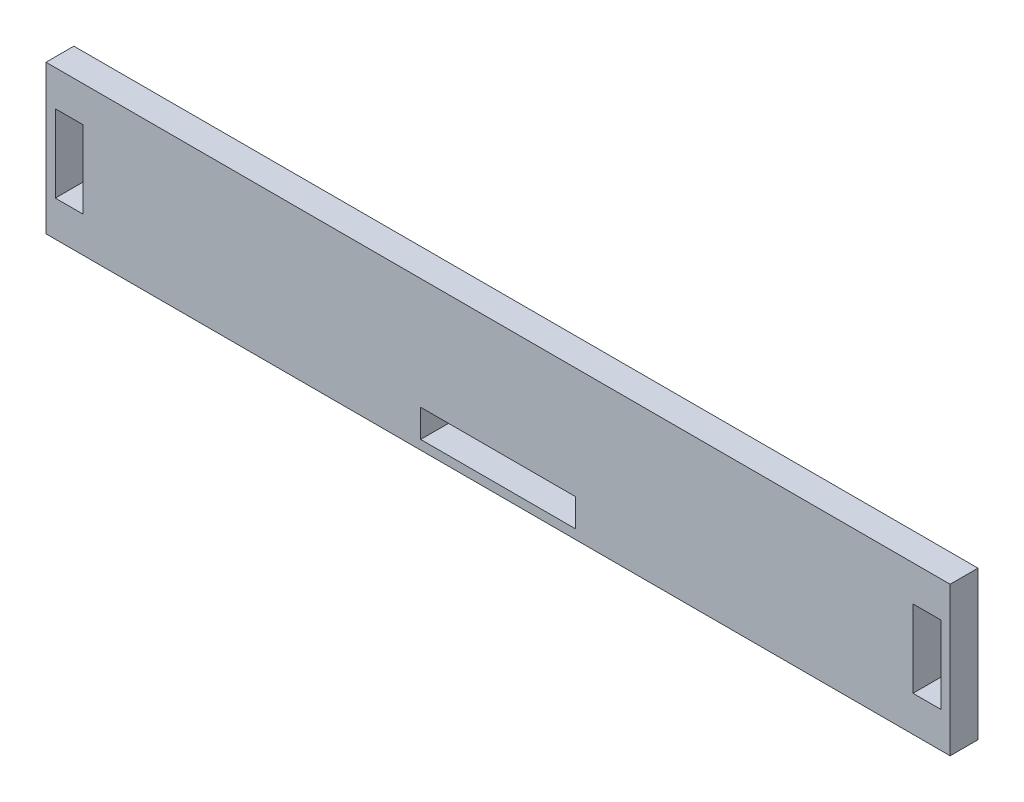
ISO-10303-21;
HEADER;
FILE_DESCRIPTION(('STEP AP214'),'2;1');
FILE_NAME('part.step','',(''),(''),'','','');
FILE_SCHEMA(('AUTOMOTIVE_DESIGN { 1 0 10303 214 1 1 1 1 }'));
ENDSEC;
DATA;
#1=APPLICATION_CONTEXT('core data for automotive mechanical design processes');
#2=APPLICATION_PROTOCOL_DEFINITION('international standard','automotive_design',2000,#1);
#3=PRODUCT_CONTEXT('',#1,'mechanical');
#4=PRODUCT('Part','Part','',(#3));
#5=PRODUCT_RELATED_PRODUCT_CATEGORY('part','',(#4));
#6=PRODUCT_DEFINITION_FORMATION('','',#4);
#7=PRODUCT_DEFINITION_CONTEXT('part definition',#1,'design');
#8=PRODUCT_DEFINITION('design','',#6,#7);
#9=PRODUCT_DEFINITION_SHAPE('','',#8);
#10=(LENGTH_UNIT() NAMED_UNIT(*) SI_UNIT(.MILLI.,.METRE.));
#11=(NAMED_UNIT(*) PLANE_ANGLE_UNIT() SI_UNIT($,.RADIAN.));
#12=(NAMED_UNIT(*) SI_UNIT($,.STERADIAN.) SOLID_ANGLE_UNIT());
#13=UNCERTAINTY_MEASURE_WITH_UNIT(LENGTH_MEASURE(1.E-05),#10,'distance_accuracy_value','');
#14=(GEOMETRIC_REPRESENTATION_CONTEXT(3) GLOBAL_UNCERTAINTY_ASSIGNED_CONTEXT((#13)) GLOBAL_UNIT_ASSIGNED_CONTEXT((#10,
#11,#12)) REPRESENTATION_CONTEXT('',''));
#15=CARTESIAN_POINT('',(0.,0.,0.));
#16=DIRECTION('',(0.,0.,1.));
#17=DIRECTION('',(1.,0.,0.));
#18=AXIS2_PLACEMENT_3D('',#15,#16,#17);
#19=CARTESIAN_POINT('',(0.,0.,18.));
#20=DIRECTION('',(0.,0.,-1.));
#21=DIRECTION('',(-1.,0.,0.));
#22=AXIS2_PLACEMENT_3D('',#19,#20,#21);
#23=PLANE('',#22);
#24=DIRECTION('',(0.,1.,0.));
#25=VECTOR('',#24,1.);
#26=CARTESIAN_POINT('',(24.,73.,18.));
#27=LINE('',#26,#25);
#28=CARTESIAN_POINT('',(24.,23.,18.));
#29=VERTEX_POINT('',#28);
#30=CARTESIAN_POINT('',(24.,73.,18.));
#31=VERTEX_POINT('',#30);
#32=EDGE_CURVE('E182',#29,#31,#27,.T.);
#33=ORIENTED_EDGE('',*,*,#32,.F.);
#34=DIRECTION('',(1.,0.,0.));
#35=VECTOR('',#34,1.);
#36=CARTESIAN_POINT('',(6.,23.,18.));
#37=LINE('',#36,#35);
#38=CARTESIAN_POINT('',(6.,23.,18.));
#39=VERTEX_POINT('',#38);
#40=EDGE_CURVE('E190',#39,#29,#37,.T.);
#41=ORIENTED_EDGE('',*,*,#40,.F.);
#42=DIRECTION('',(0.,-1.,0.));
#43=VECTOR('',#42,1.);
#44=CARTESIAN_POINT('',(6.,73.,18.));
#45=LINE('',#44,#43);
#46=CARTESIAN_POINT('',(6.,73.,18.));
#47=VERTEX_POINT('',#46);
#48=EDGE_CURVE('E187',#47,#39,#45,.T.);
#49=ORIENTED_EDGE('',*,*,#48,.F.);
#50=DIRECTION('',(-1.,0.,0.));
#51=VECTOR('',#50,1.);
#52=CARTESIAN_POINT('',(6.,73.,18.));
#53=LINE('',#52,#51);
#54=EDGE_CURVE('E184',#31,#47,#53,.T.);
#55=ORIENTED_EDGE('',*,*,#54,.F.);
#56=EDGE_LOOP('',(#33,#41,#49,#55));
#57=FACE_BOUND('',#56,.T.);
#58=DIRECTION('',(0.,-1.,0.));
#59=VECTOR('',#58,1.);
#60=CARTESIAN_POINT('',(0.,0.,18.));
#61=LINE('',#60,#59);
#62=CARTESIAN_POINT('',(0.,96.,18.));
#63=VERTEX_POINT('',#62);
#64=CARTESIAN_POINT('',(0.,0.,18.));
#65=VERTEX_POINT('',#64);
#66=EDGE_CURVE('E244',#63,#65,#61,.T.);
#67=ORIENTED_EDGE('',*,*,#66,.T.);
#68=DIRECTION('',(1.,0.,0.));
#69=VECTOR('',#68,1.);
#70=CARTESIAN_POINT('',(0.,0.,18.));
#71=LINE('',#70,#69);
#72=CARTESIAN_POINT('',(584.,0.,18.));
#73=VERTEX_POINT('',#72);
#74=EDGE_CURVE('E247',#65,#73,#71,.T.);
#75=ORIENTED_EDGE('',*,*,#74,.T.);
#76=DIRECTION('',(0.,1.,0.));
#77=VECTOR('',#76,1.);
#78=CARTESIAN_POINT('',(584.,0.,18.));
#79=LINE('',#78,#77);
#80=CARTESIAN_POINT('',(584.,96.,18.));
#81=VERTEX_POINT('',#80);
#82=EDGE_CURVE('E250',#73,#81,#79,.T.);
#83=ORIENTED_EDGE('',*,*,#82,.T.);
#84=DIRECTION('',(-1.,0.,0.));
#85=VECTOR('',#84,1.);
#86=CARTESIAN_POINT('',(0.,96.,18.));
#87=LINE('',#86,#85);
#88=EDGE_CURVE('E252',#81,#63,#87,.T.);
#89=ORIENTED_EDGE('',*,*,#88,.T.);
#90=EDGE_LOOP('',(#67,#75,#83,#89));
#91=FACE_BOUND('',#90,.T.);
#92=DIRECTION('',(0.,1.,0.));
#93=VECTOR('',#92,1.);
#94=CARTESIAN_POINT('',(342.,6.,18.));
#95=LINE('',#94,#93);
#96=CARTESIAN_POINT('',(342.,6.,18.));
#97=VERTEX_POINT('',#96);
#98=CARTESIAN_POINT('',(342.,24.,18.));
#99=VERTEX_POINT('',#98);
#100=EDGE_CURVE('E213',#97,#99,#95,.T.);
#101=ORIENTED_EDGE('',*,*,#100,.F.);
#102=DIRECTION('',(1.,0.,0.));
#103=VECTOR('',#102,1.);
#104=CARTESIAN_POINT('',(242.,6.,18.));
#105=LINE('',#104,#103);
#106=CARTESIAN_POINT('',(242.,6.,18.));
#107=VERTEX_POINT('',#106);
#108=EDGE_CURVE('E221',#107,#97,#105,.T.);
#109=ORIENTED_EDGE('',*,*,#108,.F.);
#110=DIRECTION('',(0.,-1.,0.));
#111=VECTOR('',#110,1.);
#112=CARTESIAN_POINT('',(242.,6.,18.));
#113=LINE('',#112,#111);
#114=CARTESIAN_POINT('',(242.,24.,18.));
#115=VERTEX_POINT('',#114);
#116=EDGE_CURVE('E218',#115,#107,#113,.T.);
#117=ORIENTED_EDGE('',*,*,#116,.F.);
#118=DIRECTION('',(-1.,0.,0.));
#119=VECTOR('',#118,1.);
#120=CARTESIAN_POINT('',(242.,24.,18.));
#121=LINE('',#120,#119);
#122=EDGE_CURVE('E215',#99,#115,#121,.T.);
#123=ORIENTED_EDGE('',*,*,#122,.F.);
#124=EDGE_LOOP('',(#101,#109,#117,#123));
#125=FACE_BOUND('',#124,.T.);
#126=DIRECTION('',(0.,1.,0.));
#127=VECTOR('',#126,1.);
#128=CARTESIAN_POINT('',(578.,73.,18.));
#129=LINE('',#128,#127);
#130=CARTESIAN_POINT('',(578.,23.0000000000001,18.));
#131=VERTEX_POINT('',#130);
#132=CARTESIAN_POINT('',(578.,73.,18.));
#133=VERTEX_POINT('',#132);
#134=EDGE_CURVE('E146',#131,#133,#129,.T.);
#135=ORIENTED_EDGE('',*,*,#134,.F.);
#136=DIRECTION('',(1.,0.,0.));
#137=VECTOR('',#136,1.);
#138=CARTESIAN_POINT('',(578.,23.0000000000001,18.));
#139=LINE('',#138,#137);
#140=CARTESIAN_POINT('',(560.,23.0000000000001,18.));
#141=VERTEX_POINT('',#140);
#142=EDGE_CURVE('E168',#141,#131,#139,.T.);
#143=ORIENTED_EDGE('',*,*,#142,.F.);
#144=DIRECTION('',(0.,-1.,0.));
#145=VECTOR('',#144,1.);
#146=CARTESIAN_POINT('',(560.,73.,18.));
#147=LINE('',#146,#145);
#148=CARTESIAN_POINT('',(560.,73.,18.));
#149=VERTEX_POINT('',#148);
#150=EDGE_CURVE('E166',#149,#141,#147,.T.);
#151=ORIENTED_EDGE('',*,*,#150,.F.);
#152=DIRECTION('',(-1.,0.,0.));
#153=VECTOR('',#152,1.);
#154=CARTESIAN_POINT('',(578.,73.,18.));
#155=LINE('',#154,#153);
#156=EDGE_CURVE('E154',#133,#149,#155,.T.);
#157=ORIENTED_EDGE('',*,*,#156,.F.);
#158=EDGE_LOOP('',(#135,#143,#151,#157));
#159=FACE_BOUND('',#158,.T.);
#160=ADVANCED_FACE('F33',(#57,#91,#125,#159),#23,.F.);
#161=CARTESIAN_POINT('',(0.,0.,0.));
#162=DIRECTION('',(0.,0.,-1.));
#163=DIRECTION('',(-1.,0.,0.));
#164=AXIS2_PLACEMENT_3D('',#161,#162,#163);
#165=PLANE('',#164);
#166=DIRECTION('',(0.,-1.,0.));
#167=VECTOR('',#166,1.);
#168=CARTESIAN_POINT('',(0.,0.,0.));
#169=LINE('',#168,#167);
#170=CARTESIAN_POINT('',(0.,96.,0.));
#171=VERTEX_POINT('',#170);
#172=CARTESIAN_POINT('',(0.,0.,0.));
#173=VERTEX_POINT('',#172);
#174=EDGE_CURVE('E243',#171,#173,#169,.T.);
#175=ORIENTED_EDGE('',*,*,#174,.F.);
#176=DIRECTION('',(-1.,0.,0.));
#177=VECTOR('',#176,1.);
#178=CARTESIAN_POINT('',(0.,96.,0.));
#179=LINE('',#178,#177);
#180=CARTESIAN_POINT('',(584.,96.,0.));
#181=VERTEX_POINT('',#180);
#182=EDGE_CURVE('E248',#181,#171,#179,.T.);
#183=ORIENTED_EDGE('',*,*,#182,.F.);
#184=DIRECTION('',(0.,1.,0.));
#185=VECTOR('',#184,1.);
#186=CARTESIAN_POINT('',(584.,0.,0.));
#187=LINE('',#186,#185);
#188=CARTESIAN_POINT('',(584.,0.,0.));
#189=VERTEX_POINT('',#188);
#190=EDGE_CURVE('E259',#189,#181,#187,.T.);
#191=ORIENTED_EDGE('',*,*,#190,.F.);
#192=DIRECTION('',(1.,0.,0.));
#193=VECTOR('',#192,1.);
#194=CARTESIAN_POINT('',(0.,0.,0.));
#195=LINE('',#194,#193);
#196=EDGE_CURVE('E257',#173,#189,#195,.T.);
#197=ORIENTED_EDGE('',*,*,#196,.F.);
#198=EDGE_LOOP('',(#175,#183,#191,#197));
#199=FACE_BOUND('',#198,.T.);
#200=DIRECTION('',(1.,0.,0.));
#201=VECTOR('',#200,1.);
#202=CARTESIAN_POINT('',(242.,6.,0.));
#203=LINE('',#202,#201);
#204=CARTESIAN_POINT('',(242.,6.,0.));
#205=VERTEX_POINT('',#204);
#206=CARTESIAN_POINT('',(342.,6.,0.));
#207=VERTEX_POINT('',#206);
#208=EDGE_CURVE('E216',#205,#207,#203,.T.);
#209=ORIENTED_EDGE('',*,*,#208,.T.);
#210=DIRECTION('',(0.,1.,0.));
#211=VECTOR('',#210,1.);
#212=CARTESIAN_POINT('',(342.,6.,0.));
#213=LINE('',#212,#211);
#214=CARTESIAN_POINT('',(342.,24.,0.));
#215=VERTEX_POINT('',#214);
#216=EDGE_CURVE('E212',#207,#215,#213,.T.);
#217=ORIENTED_EDGE('',*,*,#216,.T.);
#218=DIRECTION('',(-1.,0.,0.));
#219=VECTOR('',#218,1.);
#220=CARTESIAN_POINT('',(242.,24.,0.));
#221=LINE('',#220,#219);
#222=CARTESIAN_POINT('',(242.,24.,0.));
#223=VERTEX_POINT('',#222);
#224=EDGE_CURVE('E226',#215,#223,#221,.T.);
#225=ORIENTED_EDGE('',*,*,#224,.T.);
#226=DIRECTION('',(0.,-1.,0.));
#227=VECTOR('',#226,1.);
#228=CARTESIAN_POINT('',(242.,6.,0.));
#229=LINE('',#228,#227);
#230=EDGE_CURVE('E229',#223,#205,#229,.T.);
#231=ORIENTED_EDGE('',*,*,#230,.T.);
#232=EDGE_LOOP('',(#209,#217,#225,#231));
#233=FACE_BOUND('',#232,.T.);
#234=DIRECTION('',(1.,0.,0.));
#235=VECTOR('',#234,1.);
#236=CARTESIAN_POINT('',(6.,23.,0.));
#237=LINE('',#236,#235);
#238=CARTESIAN_POINT('',(6.,23.,0.));
#239=VERTEX_POINT('',#238);
#240=CARTESIAN_POINT('',(24.,23.,0.));
#241=VERTEX_POINT('',#240);
#242=EDGE_CURVE('E185',#239,#241,#237,.T.);
#243=ORIENTED_EDGE('',*,*,#242,.T.);
#244=DIRECTION('',(0.,1.,0.));
#245=VECTOR('',#244,1.);
#246=CARTESIAN_POINT('',(24.,73.,0.));
#247=LINE('',#246,#245);
#248=CARTESIAN_POINT('',(24.,73.,0.));
#249=VERTEX_POINT('',#248);
#250=EDGE_CURVE('E162',#241,#249,#247,.T.);
#251=ORIENTED_EDGE('',*,*,#250,.T.);
#252=DIRECTION('',(-1.,0.,0.));
#253=VECTOR('',#252,1.);
#254=CARTESIAN_POINT('',(6.,73.,0.));
#255=LINE('',#254,#253);
#256=CARTESIAN_POINT('',(6.,73.,0.));
#257=VERTEX_POINT('',#256);
#258=EDGE_CURVE('E195',#249,#257,#255,.T.);
#259=ORIENTED_EDGE('',*,*,#258,.T.);
#260=DIRECTION('',(0.,-1.,0.));
#261=VECTOR('',#260,1.);
#262=CARTESIAN_POINT('',(6.,73.,0.));
#263=LINE('',#262,#261);
#264=EDGE_CURVE('E198',#257,#239,#263,.T.);
#265=ORIENTED_EDGE('',*,*,#264,.T.);
#266=EDGE_LOOP('',(#243,#251,#259,#265));
#267=FACE_BOUND('',#266,.T.);
#268=DIRECTION('',(1.,0.,0.));
#269=VECTOR('',#268,1.);
#270=CARTESIAN_POINT('',(578.,23.0000000000001,0.));
#271=LINE('',#270,#269);
#272=CARTESIAN_POINT('',(560.,23.0000000000001,0.));
#273=VERTEX_POINT('',#272);
#274=CARTESIAN_POINT('',(578.,23.0000000000001,0.));
#275=VERTEX_POINT('',#274);
#276=EDGE_CURVE('E155',#273,#275,#271,.T.);
#277=ORIENTED_EDGE('',*,*,#276,.T.);
#278=DIRECTION('',(0.,1.,0.));
#279=VECTOR('',#278,1.);
#280=CARTESIAN_POINT('',(578.,73.,0.));
#281=LINE('',#280,#279);
#282=CARTESIAN_POINT('',(578.,73.,0.));
#283=VERTEX_POINT('',#282);
#284=EDGE_CURVE('E56',#275,#283,#281,.T.);
#285=ORIENTED_EDGE('',*,*,#284,.T.);
#286=DIRECTION('',(-1.,0.,0.));
#287=VECTOR('',#286,1.);
#288=CARTESIAN_POINT('',(578.,73.,0.));
#289=LINE('',#288,#287);
#290=CARTESIAN_POINT('',(560.,73.,0.));
#291=VERTEX_POINT('',#290);
#292=EDGE_CURVE('E161',#283,#291,#289,.T.);
#293=ORIENTED_EDGE('',*,*,#292,.T.);
#294=DIRECTION('',(0.,-1.,0.));
#295=VECTOR('',#294,1.);
#296=CARTESIAN_POINT('',(560.,73.,0.));
#297=LINE('',#296,#295);
#298=EDGE_CURVE('E174',#291,#273,#297,.T.);
#299=ORIENTED_EDGE('',*,*,#298,.T.);
#300=EDGE_LOOP('',(#277,#285,#293,#299));
#301=FACE_BOUND('',#300,.T.);
#302=ADVANCED_FACE('F277',(#199,#233,#267,#301),#165,.T.);
#303=CARTESIAN_POINT('',(0.,0.,18.));
#304=DIRECTION('',(1.,0.,0.));
#305=DIRECTION('',(0.,0.,-1.));
#306=AXIS2_PLACEMENT_3D('',#303,#304,#305);
#307=PLANE('',#306);
#308=ORIENTED_EDGE('',*,*,#174,.T.);
#309=DIRECTION('',(0.,0.,-1.));
#310=VECTOR('',#309,1.);
#311=CARTESIAN_POINT('',(0.,0.,18.));
#312=LINE('',#311,#310);
#313=EDGE_CURVE('E11',#65,#173,#312,.T.);
#314=ORIENTED_EDGE('',*,*,#313,.F.);
#315=ORIENTED_EDGE('',*,*,#66,.F.);
#316=DIRECTION('',(0.,0.,-1.));
#317=VECTOR('',#316,1.);
#318=CARTESIAN_POINT('',(0.,96.,18.));
#319=LINE('',#318,#317);
#320=EDGE_CURVE('E254',#63,#171,#319,.T.);
#321=ORIENTED_EDGE('',*,*,#320,.T.);
#322=EDGE_LOOP('',(#308,#314,#315,#321));
#323=FACE_BOUND('',#322,.T.);
#324=ADVANCED_FACE('F35',(#323),#307,.F.);
#325=CARTESIAN_POINT('',(0.,0.,18.));
#326=DIRECTION('',(0.,1.,0.));
#327=DIRECTION('',(0.,0.,1.));
#328=AXIS2_PLACEMENT_3D('',#325,#326,#327);
#329=PLANE('',#328);
#330=ORIENTED_EDGE('',*,*,#196,.T.);
#331=DIRECTION('',(0.,0.,-1.));
#332=VECTOR('',#331,1.);
#333=CARTESIAN_POINT('',(584.,0.,18.));
#334=LINE('',#333,#332);
#335=EDGE_CURVE('E41',#73,#189,#334,.T.);
#336=ORIENTED_EDGE('',*,*,#335,.F.);
#337=ORIENTED_EDGE('',*,*,#74,.F.);
#338=ORIENTED_EDGE('',*,*,#313,.T.);
#339=EDGE_LOOP('',(#330,#336,#337,#338));
#340=FACE_BOUND('',#339,.T.);
#341=ADVANCED_FACE('F288',(#340),#329,.F.);
#342=CARTESIAN_POINT('',(584.,0.,18.));
#343=DIRECTION('',(-1.,0.,0.));
#344=DIRECTION('',(0.,0.,1.));
#345=AXIS2_PLACEMENT_3D('',#342,#343,#344);
#346=PLANE('',#345);
#347=ORIENTED_EDGE('',*,*,#190,.T.);
#348=DIRECTION('',(0.,0.,-1.));
#349=VECTOR('',#348,1.);
#350=CARTESIAN_POINT('',(584.,96.,18.));
#351=LINE('',#350,#349);
#352=EDGE_CURVE('E264',#81,#181,#351,.T.);
#353=ORIENTED_EDGE('',*,*,#352,.F.);
#354=ORIENTED_EDGE('',*,*,#82,.F.);
#355=ORIENTED_EDGE('',*,*,#335,.T.);
#356=EDGE_LOOP('',(#347,#353,#354,#355));
#357=FACE_BOUND('',#356,.T.);
#358=ADVANCED_FACE('F271',(#357),#346,.F.);
#359=CARTESIAN_POINT('',(0.,96.,18.));
#360=DIRECTION('',(0.,-1.,0.));
#361=DIRECTION('',(0.,0.,-1.));
#362=AXIS2_PLACEMENT_3D('',#359,#360,#361);
#363=PLANE('',#362);
#364=ORIENTED_EDGE('',*,*,#182,.T.);
#365=ORIENTED_EDGE('',*,*,#320,.F.);
#366=ORIENTED_EDGE('',*,*,#88,.F.);
#367=ORIENTED_EDGE('',*,*,#352,.T.);
#368=EDGE_LOOP('',(#364,#365,#366,#367));
#369=FACE_BOUND('',#368,.T.);
#370=ADVANCED_FACE('F281',(#369),#363,.F.);
#371=CARTESIAN_POINT('',(342.,6.,18.));
#372=DIRECTION('',(-1.,0.,0.));
#373=DIRECTION('',(0.,0.,1.));
#374=AXIS2_PLACEMENT_3D('',#371,#372,#373);
#375=PLANE('',#374);
#376=ORIENTED_EDGE('',*,*,#216,.F.);
#377=DIRECTION('',(0.,0.,-1.));
#378=VECTOR('',#377,1.);
#379=CARTESIAN_POINT('',(342.,6.,18.));
#380=LINE('',#379,#378);
#381=EDGE_CURVE('E223',#97,#207,#380,.T.);
#382=ORIENTED_EDGE('',*,*,#381,.F.);
#383=ORIENTED_EDGE('',*,*,#100,.T.);
#384=DIRECTION('',(0.,0.,-1.));
#385=VECTOR('',#384,1.);
#386=CARTESIAN_POINT('',(342.,24.,18.));
#387=LINE('',#386,#385);
#388=EDGE_CURVE('E240',#99,#215,#387,.T.);
#389=ORIENTED_EDGE('',*,*,#388,.T.);
#390=EDGE_LOOP('',(#376,#382,#383,#389));
#391=FACE_BOUND('',#390,.T.);
#392=ADVANCED_FACE('F304',(#391),#375,.T.);
#393=CARTESIAN_POINT('',(242.,24.,18.));
#394=DIRECTION('',(0.,-1.,0.));
#395=DIRECTION('',(0.,0.,-1.));
#396=AXIS2_PLACEMENT_3D('',#393,#394,#395);
#397=PLANE('',#396);
#398=ORIENTED_EDGE('',*,*,#224,.F.);
#399=ORIENTED_EDGE('',*,*,#388,.F.);
#400=ORIENTED_EDGE('',*,*,#122,.T.);
#401=DIRECTION('',(0.,0.,-1.));
#402=VECTOR('',#401,1.);
#403=CARTESIAN_POINT('',(242.,24.,18.));
#404=LINE('',#403,#402);
#405=EDGE_CURVE('E238',#115,#223,#404,.T.);
#406=ORIENTED_EDGE('',*,*,#405,.T.);
#407=EDGE_LOOP('',(#398,#399,#400,#406));
#408=FACE_BOUND('',#407,.T.);
#409=ADVANCED_FACE('F311',(#408),#397,.T.);
#410=CARTESIAN_POINT('',(242.,6.,18.));
#411=DIRECTION('',(1.,0.,0.));
#412=DIRECTION('',(0.,0.,-1.));
#413=AXIS2_PLACEMENT_3D('',#410,#411,#412);
#414=PLANE('',#413);
#415=ORIENTED_EDGE('',*,*,#230,.F.);
#416=ORIENTED_EDGE('',*,*,#405,.F.);
#417=ORIENTED_EDGE('',*,*,#116,.T.);
#418=DIRECTION('',(0.,0.,-1.));
#419=VECTOR('',#418,1.);
#420=CARTESIAN_POINT('',(242.,6.,18.));
#421=LINE('',#420,#419);
#422=EDGE_CURVE('E236',#107,#205,#421,.T.);
#423=ORIENTED_EDGE('',*,*,#422,.T.);
#424=EDGE_LOOP('',(#415,#416,#417,#423));
#425=FACE_BOUND('',#424,.T.);
#426=ADVANCED_FACE('F316',(#425),#414,.T.);
#427=CARTESIAN_POINT('',(242.,6.,18.));
#428=DIRECTION('',(0.,1.,0.));
#429=DIRECTION('',(0.,0.,1.));
#430=AXIS2_PLACEMENT_3D('',#427,#428,#429);
#431=PLANE('',#430);
#432=ORIENTED_EDGE('',*,*,#208,.F.);
#433=ORIENTED_EDGE('',*,*,#422,.F.);
#434=ORIENTED_EDGE('',*,*,#108,.T.);
#435=ORIENTED_EDGE('',*,*,#381,.T.);
#436=EDGE_LOOP('',(#432,#433,#434,#435));
#437=FACE_BOUND('',#436,.T.);
#438=ADVANCED_FACE('F323',(#437),#431,.T.);
#439=CARTESIAN_POINT('',(24.,73.,18.));
#440=DIRECTION('',(-1.,0.,0.));
#441=DIRECTION('',(0.,-1.,0.));
#442=AXIS2_PLACEMENT_3D('',#439,#440,#441);
#443=PLANE('',#442);
#444=ORIENTED_EDGE('',*,*,#250,.F.);
#445=DIRECTION('',(0.,0.,-1.));
#446=VECTOR('',#445,1.);
#447=CARTESIAN_POINT('',(24.,23.,18.));
#448=LINE('',#447,#446);
#449=EDGE_CURVE('E192',#29,#241,#448,.T.);
#450=ORIENTED_EDGE('',*,*,#449,.F.);
#451=ORIENTED_EDGE('',*,*,#32,.T.);
#452=DIRECTION('',(0.,0.,-1.));
#453=VECTOR('',#452,1.);
#454=CARTESIAN_POINT('',(24.,73.,18.));
#455=LINE('',#454,#453);
#456=EDGE_CURVE('E209',#31,#249,#455,.T.);
#457=ORIENTED_EDGE('',*,*,#456,.T.);
#458=EDGE_LOOP('',(#444,#450,#451,#457));
#459=FACE_BOUND('',#458,.T.);
#460=ADVANCED_FACE('F336',(#459),#443,.T.);
#461=CARTESIAN_POINT('',(6.,73.,18.));
#462=DIRECTION('',(0.,-1.,0.));
#463=DIRECTION('',(0.,0.,-1.));
#464=AXIS2_PLACEMENT_3D('',#461,#462,#463);
#465=PLANE('',#464);
#466=ORIENTED_EDGE('',*,*,#258,.F.);
#467=ORIENTED_EDGE('',*,*,#456,.F.);
#468=ORIENTED_EDGE('',*,*,#54,.T.);
#469=DIRECTION('',(0.,0.,-1.));
#470=VECTOR('',#469,1.);
#471=CARTESIAN_POINT('',(6.,73.,18.));
#472=LINE('',#471,#470);
#473=EDGE_CURVE('E207',#47,#257,#472,.T.);
#474=ORIENTED_EDGE('',*,*,#473,.T.);
#475=EDGE_LOOP('',(#466,#467,#468,#474));
#476=FACE_BOUND('',#475,.T.);
#477=ADVANCED_FACE('F341',(#476),#465,.T.);
#478=CARTESIAN_POINT('',(6.,73.,18.));
#479=DIRECTION('',(1.,0.,0.));
#480=DIRECTION('',(0.,1.,0.));
#481=AXIS2_PLACEMENT_3D('',#478,#479,#480);
#482=PLANE('',#481);
#483=ORIENTED_EDGE('',*,*,#264,.F.);
#484=ORIENTED_EDGE('',*,*,#473,.F.);
#485=ORIENTED_EDGE('',*,*,#48,.T.);
#486=DIRECTION('',(0.,0.,-1.));
#487=VECTOR('',#486,1.);
#488=CARTESIAN_POINT('',(6.,23.,18.));
#489=LINE('',#488,#487);
#490=EDGE_CURVE('E205',#39,#239,#489,.T.);
#491=ORIENTED_EDGE('',*,*,#490,.T.);
#492=EDGE_LOOP('',(#483,#484,#485,#491));
#493=FACE_BOUND('',#492,.T.);
#494=ADVANCED_FACE('F345',(#493),#482,.T.);
#495=CARTESIAN_POINT('',(6.,23.,18.));
#496=DIRECTION('',(0.,1.,0.));
#497=DIRECTION('',(0.,0.,1.));
#498=AXIS2_PLACEMENT_3D('',#495,#496,#497);
#499=PLANE('',#498);
#500=ORIENTED_EDGE('',*,*,#242,.F.);
#501=ORIENTED_EDGE('',*,*,#490,.F.);
#502=ORIENTED_EDGE('',*,*,#40,.T.);
#503=ORIENTED_EDGE('',*,*,#449,.T.);
#504=EDGE_LOOP('',(#500,#501,#502,#503));
#505=FACE_BOUND('',#504,.T.);
#506=ADVANCED_FACE('F349',(#505),#499,.T.);
#507=CARTESIAN_POINT('',(578.,73.,18.));
#508=DIRECTION('',(-1.,0.,0.));
#509=DIRECTION('',(0.,0.,1.));
#510=AXIS2_PLACEMENT_3D('',#507,#508,#509);
#511=PLANE('',#510);
#512=ORIENTED_EDGE('',*,*,#284,.F.);
#513=DIRECTION('',(0.,0.,-1.));
#514=VECTOR('',#513,1.);
#515=CARTESIAN_POINT('',(578.,23.0000000000001,18.));
#516=LINE('',#515,#514);
#517=EDGE_CURVE('E150',#131,#275,#516,.T.);
#518=ORIENTED_EDGE('',*,*,#517,.F.);
#519=ORIENTED_EDGE('',*,*,#134,.T.);
#520=DIRECTION('',(0.,0.,-1.));
#521=VECTOR('',#520,1.);
#522=CARTESIAN_POINT('',(578.,73.,18.));
#523=LINE('',#522,#521);
#524=EDGE_CURVE('E149',#133,#283,#523,.T.);
#525=ORIENTED_EDGE('',*,*,#524,.T.);
#526=EDGE_LOOP('',(#512,#518,#519,#525));
#527=FACE_BOUND('',#526,.T.);
#528=ADVANCED_FACE('F148',(#527),#511,.T.);
#529=CARTESIAN_POINT('',(578.,73.,18.));
#530=DIRECTION('',(0.,-1.,0.));
#531=DIRECTION('',(0.,0.,-1.));
#532=AXIS2_PLACEMENT_3D('',#529,#530,#531);
#533=PLANE('',#532);
#534=ORIENTED_EDGE('',*,*,#292,.F.);
#535=ORIENTED_EDGE('',*,*,#524,.F.);
#536=ORIENTED_EDGE('',*,*,#156,.T.);
#537=DIRECTION('',(0.,0.,-1.));
#538=VECTOR('',#537,1.);
#539=CARTESIAN_POINT('',(560.,73.,18.));
#540=LINE('',#539,#538);
#541=EDGE_CURVE('E163',#149,#291,#540,.T.);
#542=ORIENTED_EDGE('',*,*,#541,.T.);
#543=EDGE_LOOP('',(#534,#535,#536,#542));
#544=FACE_BOUND('',#543,.T.);
#545=ADVANCED_FACE('F158',(#544),#533,.T.);
#546=CARTESIAN_POINT('',(560.,73.,18.));
#547=DIRECTION('',(1.,0.,0.));
#548=DIRECTION('',(0.,0.,-1.));
#549=AXIS2_PLACEMENT_3D('',#546,#547,#548);
#550=PLANE('',#549);
#551=ORIENTED_EDGE('',*,*,#298,.F.);
#552=ORIENTED_EDGE('',*,*,#541,.F.);
#553=ORIENTED_EDGE('',*,*,#150,.T.);
#554=DIRECTION('',(0.,0.,-1.));
#555=VECTOR('',#554,1.);
#556=CARTESIAN_POINT('',(560.,23.0000000000001,18.));
#557=LINE('',#556,#555);
#558=EDGE_CURVE('E48',#141,#273,#557,.T.);
#559=ORIENTED_EDGE('',*,*,#558,.T.);
#560=EDGE_LOOP('',(#551,#552,#553,#559));
#561=FACE_BOUND('',#560,.T.);
#562=ADVANCED_FACE('F358',(#561),#550,.T.);
#563=CARTESIAN_POINT('',(578.,23.0000000000001,18.));
#564=DIRECTION('',(0.,1.,0.));
#565=DIRECTION('',(0.,0.,1.));
#566=AXIS2_PLACEMENT_3D('',#563,#564,#565);
#567=PLANE('',#566);
#568=ORIENTED_EDGE('',*,*,#276,.F.);
#569=ORIENTED_EDGE('',*,*,#558,.F.);
#570=ORIENTED_EDGE('',*,*,#142,.T.);
#571=ORIENTED_EDGE('',*,*,#517,.T.);
#572=EDGE_LOOP('',(#568,#569,#570,#571));
#573=FACE_BOUND('',#572,.T.);
#574=ADVANCED_FACE('F361',(#573),#567,.T.);
#575=CLOSED_SHELL('',(#160,#302,#324,#341,#358,#370,#392,#409,#426,#438,#460,#477,#494,#506,
#528,#545,#562,#574));
#576=MANIFOLD_SOLID_BREP('B2',#575);
#577=ADVANCED_BREP_SHAPE_REPRESENTATION('',(#18,#576),#14);
#578=SHAPE_DEFINITION_REPRESENTATION(#9,#577);
ENDSEC;
END-ISO-10303-21;
